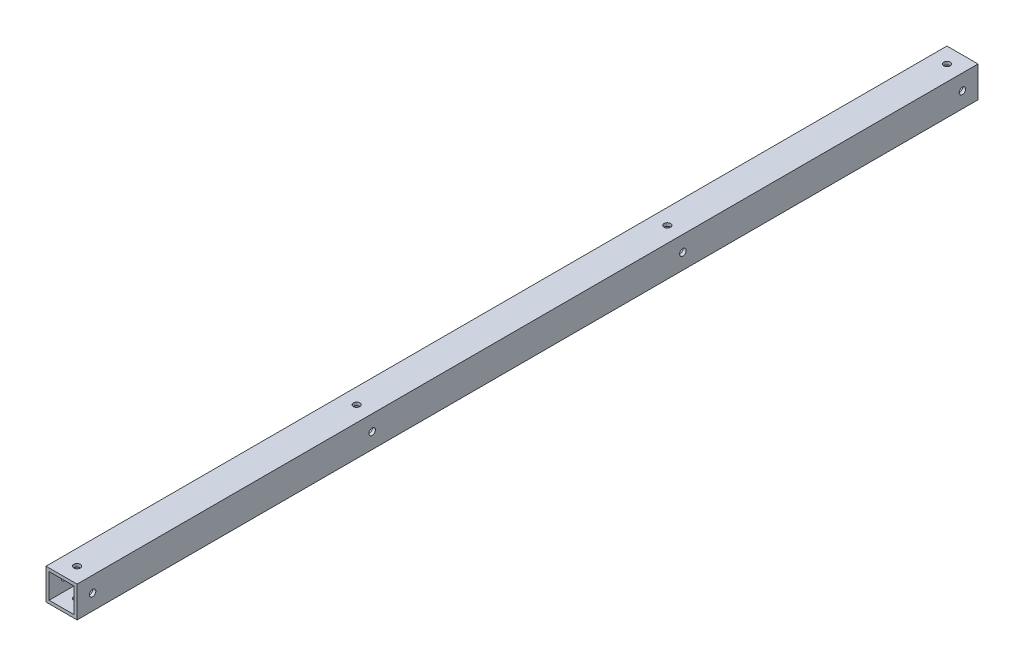
ISO-10303-21;
HEADER;
FILE_DESCRIPTION(('STEP AP214'),'2;1');
FILE_NAME('part.step','',(''),(''),'','','');
FILE_SCHEMA(('AUTOMOTIVE_DESIGN { 1 0 10303 214 1 1 1 1 }'));
ENDSEC;
DATA;
#1=APPLICATION_CONTEXT('core data for automotive mechanical design processes');
#2=APPLICATION_PROTOCOL_DEFINITION('international standard','automotive_design',2000,#1);
#3=PRODUCT_CONTEXT('',#1,'mechanical');
#4=PRODUCT('Part','Part','',(#3));
#5=PRODUCT_RELATED_PRODUCT_CATEGORY('part','',(#4));
#6=PRODUCT_DEFINITION_FORMATION('','',#4);
#7=PRODUCT_DEFINITION_CONTEXT('part definition',#1,'design');
#8=PRODUCT_DEFINITION('design','',#6,#7);
#9=PRODUCT_DEFINITION_SHAPE('','',#8);
#10=(LENGTH_UNIT() NAMED_UNIT(*) SI_UNIT(.MILLI.,.METRE.));
#11=(NAMED_UNIT(*) PLANE_ANGLE_UNIT() SI_UNIT($,.RADIAN.));
#12=(NAMED_UNIT(*) SI_UNIT($,.STERADIAN.) SOLID_ANGLE_UNIT());
#13=UNCERTAINTY_MEASURE_WITH_UNIT(LENGTH_MEASURE(1.E-05),#10,'distance_accuracy_value','');
#14=(GEOMETRIC_REPRESENTATION_CONTEXT(3) GLOBAL_UNCERTAINTY_ASSIGNED_CONTEXT((#13)) GLOBAL_UNIT_ASSIGNED_CONTEXT((#10,
#11,#12)) REPRESENTATION_CONTEXT('',''));
#15=CARTESIAN_POINT('',(0.,0.,0.));
#16=DIRECTION('',(0.,0.,1.));
#17=DIRECTION('',(1.,0.,0.));
#18=AXIS2_PLACEMENT_3D('',#15,#16,#17);
#19=CARTESIAN_POINT('',(0.,-10.,580.));
#20=DIRECTION('',(0.,1.,0.));
#21=DIRECTION('',(0.,0.,1.));
#22=AXIS2_PLACEMENT_3D('',#19,#20,#21);
#23=PLANE('',#22);
#24=CARTESIAN_POINT('',(0.,-10.,570.));
#25=DIRECTION('',(0.,-1.,0.));
#26=DIRECTION('',(0.,0.,-1.));
#27=AXIS2_PLACEMENT_3D('',#24,#25,#26);
#28=CIRCLE('',#27,2.1);
#29=CARTESIAN_POINT('',(0.,-10.,567.9));
#30=VERTEX_POINT('',#29);
#31=EDGE_CURVE('E180',#30,#30,#28,.T.);
#32=ORIENTED_EDGE('',*,*,#31,.F.);
#33=EDGE_LOOP('',(#32));
#34=FACE_BOUND('',#33,.T.);
#35=CARTESIAN_POINT('',(0.,-10.,390.));
#36=DIRECTION('',(0.,-1.,0.));
#37=DIRECTION('',(0.,0.,-1.));
#38=AXIS2_PLACEMENT_3D('',#35,#36,#37);
#39=CIRCLE('',#38,2.09999999999999);
#40=CARTESIAN_POINT('',(0.,-10.,387.9));
#41=VERTEX_POINT('',#40);
#42=EDGE_CURVE('E191',#41,#41,#39,.T.);
#43=ORIENTED_EDGE('',*,*,#42,.F.);
#44=EDGE_LOOP('',(#43));
#45=FACE_BOUND('',#44,.T.);
#46=CARTESIAN_POINT('',(0.,-10.,10.));
#47=DIRECTION('',(0.,1.,0.));
#48=DIRECTION('',(0.,0.,1.));
#49=AXIS2_PLACEMENT_3D('',#46,#47,#48);
#50=CIRCLE('',#49,2.1);
#51=CARTESIAN_POINT('',(0.,-10.,12.1));
#52=VERTEX_POINT('',#51);
#53=EDGE_CURVE('E174',#52,#52,#50,.T.);
#54=ORIENTED_EDGE('',*,*,#53,.T.);
#55=EDGE_LOOP('',(#54));
#56=FACE_BOUND('',#55,.T.);
#57=CARTESIAN_POINT('',(0.,-10.,190.));
#58=DIRECTION('',(0.,1.,0.));
#59=DIRECTION('',(0.,0.,1.));
#60=AXIS2_PLACEMENT_3D('',#57,#58,#59);
#61=CIRCLE('',#60,2.09999999999999);
#62=CARTESIAN_POINT('',(0.,-10.,192.1));
#63=VERTEX_POINT('',#62);
#64=EDGE_CURVE('E205',#63,#63,#61,.T.);
#65=ORIENTED_EDGE('',*,*,#64,.T.);
#66=EDGE_LOOP('',(#65));
#67=FACE_BOUND('',#66,.T.);
#68=DIRECTION('',(1.,0.,0.));
#69=VECTOR('',#68,1.);
#70=CARTESIAN_POINT('',(0.,-10.,0.));
#71=LINE('',#70,#69);
#72=CARTESIAN_POINT('',(-10.,-10.,0.));
#73=VERTEX_POINT('',#72);
#74=CARTESIAN_POINT('',(10.,-10.,0.));
#75=VERTEX_POINT('',#74);
#76=EDGE_CURVE('E152',#73,#75,#71,.T.);
#77=ORIENTED_EDGE('',*,*,#76,.T.);
#78=DIRECTION('',(0.,0.,-1.));
#79=VECTOR('',#78,1.);
#80=CARTESIAN_POINT('',(10.,-10.,580.));
#81=LINE('',#80,#79);
#82=CARTESIAN_POINT('',(10.,-10.,580.));
#83=VERTEX_POINT('',#82);
#84=EDGE_CURVE('E11',#83,#75,#81,.T.);
#85=ORIENTED_EDGE('',*,*,#84,.F.);
#86=DIRECTION('',(1.,0.,0.));
#87=VECTOR('',#86,1.);
#88=CARTESIAN_POINT('',(0.,-10.,580.));
#89=LINE('',#88,#87);
#90=CARTESIAN_POINT('',(-10.,-10.,580.));
#91=VERTEX_POINT('',#90);
#92=EDGE_CURVE('E123',#91,#83,#89,.T.);
#93=ORIENTED_EDGE('',*,*,#92,.F.);
#94=DIRECTION('',(0.,0.,-1.));
#95=VECTOR('',#94,1.);
#96=CARTESIAN_POINT('',(-10.,-10.,580.));
#97=LINE('',#96,#95);
#98=EDGE_CURVE('E62',#91,#73,#97,.T.);
#99=ORIENTED_EDGE('',*,*,#98,.T.);
#100=EDGE_LOOP('',(#77,#85,#93,#99));
#101=FACE_BOUND('',#100,.T.);
#102=ADVANCED_FACE('F43',(#34,#45,#56,#67,#101),#23,.F.);
#103=CARTESIAN_POINT('',(10.,0.,580.));
#104=DIRECTION('',(-1.,0.,0.));
#105=DIRECTION('',(0.,0.,1.));
#106=AXIS2_PLACEMENT_3D('',#103,#104,#105);
#107=PLANE('',#106);
#108=CARTESIAN_POINT('',(10.,0.,570.));
#109=DIRECTION('',(1.,0.,0.));
#110=DIRECTION('',(0.,0.,-1.));
#111=AXIS2_PLACEMENT_3D('',#108,#109,#110);
#112=CIRCLE('',#111,2.10000000000004);
#113=CARTESIAN_POINT('',(10.,0.,567.9));
#114=VERTEX_POINT('',#113);
#115=EDGE_CURVE('E380',#114,#114,#112,.T.);
#116=ORIENTED_EDGE('',*,*,#115,.F.);
#117=EDGE_LOOP('',(#116));
#118=FACE_BOUND('',#117,.T.);
#119=CARTESIAN_POINT('',(10.,0.,190.));
#120=DIRECTION('',(1.,0.,0.));
#121=DIRECTION('',(0.,0.,1.));
#122=AXIS2_PLACEMENT_3D('',#119,#120,#121);
#123=CIRCLE('',#122,2.09999999999999);
#124=CARTESIAN_POINT('',(10.,0.,192.1));
#125=VERTEX_POINT('',#124);
#126=EDGE_CURVE('E371',#125,#125,#123,.T.);
#127=ORIENTED_EDGE('',*,*,#126,.F.);
#128=EDGE_LOOP('',(#127));
#129=FACE_BOUND('',#128,.T.);
#130=CARTESIAN_POINT('',(10.,0.,390.));
#131=DIRECTION('',(1.,0.,0.));
#132=DIRECTION('',(0.,0.,-1.));
#133=AXIS2_PLACEMENT_3D('',#130,#131,#132);
#134=CIRCLE('',#133,2.09999999999999);
#135=CARTESIAN_POINT('',(10.,0.,387.9));
#136=VERTEX_POINT('',#135);
#137=EDGE_CURVE('E370',#136,#136,#134,.T.);
#138=ORIENTED_EDGE('',*,*,#137,.F.);
#139=EDGE_LOOP('',(#138));
#140=FACE_BOUND('',#139,.T.);
#141=CARTESIAN_POINT('',(10.,0.,10.));
#142=DIRECTION('',(1.,0.,0.));
#143=DIRECTION('',(0.,0.,-1.));
#144=AXIS2_PLACEMENT_3D('',#141,#142,#143);
#145=CIRCLE('',#144,2.10000000000004);
#146=CARTESIAN_POINT('',(10.,0.,7.89999999999997));
#147=VERTEX_POINT('',#146);
#148=EDGE_CURVE('E377',#147,#147,#145,.T.);
#149=ORIENTED_EDGE('',*,*,#148,.F.);
#150=EDGE_LOOP('',(#149));
#151=FACE_BOUND('',#150,.T.);
#152=DIRECTION('',(0.,1.,0.));
#153=VECTOR('',#152,1.);
#154=CARTESIAN_POINT('',(10.,0.,0.));
#155=LINE('',#154,#153);
#156=CARTESIAN_POINT('',(10.,10.,0.));
#157=VERTEX_POINT('',#156);
#158=EDGE_CURVE('E129',#75,#157,#155,.T.);
#159=ORIENTED_EDGE('',*,*,#158,.T.);
#160=DIRECTION('',(0.,0.,-1.));
#161=VECTOR('',#160,1.);
#162=CARTESIAN_POINT('',(10.,10.,580.));
#163=LINE('',#162,#161);
#164=CARTESIAN_POINT('',(10.,10.,580.));
#165=VERTEX_POINT('',#164);
#166=EDGE_CURVE('E53',#165,#157,#163,.T.);
#167=ORIENTED_EDGE('',*,*,#166,.F.);
#168=DIRECTION('',(0.,1.,0.));
#169=VECTOR('',#168,1.);
#170=CARTESIAN_POINT('',(10.,0.,580.));
#171=LINE('',#170,#169);
#172=EDGE_CURVE('E117',#83,#165,#171,.T.);
#173=ORIENTED_EDGE('',*,*,#172,.F.);
#174=ORIENTED_EDGE('',*,*,#84,.T.);
#175=EDGE_LOOP('',(#159,#167,#173,#174));
#176=FACE_BOUND('',#175,.T.);
#177=ADVANCED_FACE('F128',(#118,#129,#140,#151,#176),#107,.F.);
#178=CARTESIAN_POINT('',(0.,10.,580.));
#179=DIRECTION('',(0.,1.,0.));
#180=DIRECTION('',(0.,0.,1.));
#181=AXIS2_PLACEMENT_3D('',#178,#179,#180);
#182=PLANE('',#181);
#183=CARTESIAN_POINT('',(0.,10.,570.));
#184=DIRECTION('',(0.,-1.,0.));
#185=DIRECTION('',(0.,0.,-1.));
#186=AXIS2_PLACEMENT_3D('',#183,#184,#185);
#187=CIRCLE('',#186,2.1);
#188=CARTESIAN_POINT('',(0.,10.,567.9));
#189=VERTEX_POINT('',#188);
#190=EDGE_CURVE('E186',#189,#189,#187,.T.);
#191=ORIENTED_EDGE('',*,*,#190,.T.);
#192=EDGE_LOOP('',(#191));
#193=FACE_BOUND('',#192,.T.);
#194=CARTESIAN_POINT('',(0.,10.,390.));
#195=DIRECTION('',(0.,-1.,0.));
#196=DIRECTION('',(0.,0.,-1.));
#197=AXIS2_PLACEMENT_3D('',#194,#195,#196);
#198=CIRCLE('',#197,2.09999999999999);
#199=CARTESIAN_POINT('',(0.,10.,387.9));
#200=VERTEX_POINT('',#199);
#201=EDGE_CURVE('E199',#200,#200,#198,.T.);
#202=ORIENTED_EDGE('',*,*,#201,.T.);
#203=EDGE_LOOP('',(#202));
#204=FACE_BOUND('',#203,.T.);
#205=CARTESIAN_POINT('',(0.,10.,10.));
#206=DIRECTION('',(0.,1.,0.));
#207=DIRECTION('',(0.,0.,1.));
#208=AXIS2_PLACEMENT_3D('',#205,#206,#207);
#209=CIRCLE('',#208,2.1);
#210=CARTESIAN_POINT('',(0.,10.,12.1));
#211=VERTEX_POINT('',#210);
#212=EDGE_CURVE('E208',#211,#211,#209,.T.);
#213=ORIENTED_EDGE('',*,*,#212,.F.);
#214=EDGE_LOOP('',(#213));
#215=FACE_BOUND('',#214,.T.);
#216=CARTESIAN_POINT('',(0.,10.,190.));
#217=DIRECTION('',(0.,1.,0.));
#218=DIRECTION('',(0.,0.,1.));
#219=AXIS2_PLACEMENT_3D('',#216,#217,#218);
#220=CIRCLE('',#219,2.09999999999999);
#221=CARTESIAN_POINT('',(0.,10.,192.1));
#222=VERTEX_POINT('',#221);
#223=EDGE_CURVE('E211',#222,#222,#220,.T.);
#224=ORIENTED_EDGE('',*,*,#223,.F.);
#225=EDGE_LOOP('',(#224));
#226=FACE_BOUND('',#225,.T.);
#227=DIRECTION('',(1.,0.,0.));
#228=VECTOR('',#227,1.);
#229=CARTESIAN_POINT('',(0.,10.,0.));
#230=LINE('',#229,#228);
#231=CARTESIAN_POINT('',(-10.,10.,0.));
#232=VERTEX_POINT('',#231);
#233=EDGE_CURVE('E155',#232,#157,#230,.T.);
#234=ORIENTED_EDGE('',*,*,#233,.F.);
#235=DIRECTION('',(0.,0.,-1.));
#236=VECTOR('',#235,1.);
#237=CARTESIAN_POINT('',(-10.,10.,580.));
#238=LINE('',#237,#236);
#239=CARTESIAN_POINT('',(-10.,10.,580.));
#240=VERTEX_POINT('',#239);
#241=EDGE_CURVE('E88',#240,#232,#238,.T.);
#242=ORIENTED_EDGE('',*,*,#241,.F.);
#243=DIRECTION('',(1.,0.,0.));
#244=VECTOR('',#243,1.);
#245=CARTESIAN_POINT('',(0.,10.,580.));
#246=LINE('',#245,#244);
#247=EDGE_CURVE('E122',#240,#165,#246,.T.);
#248=ORIENTED_EDGE('',*,*,#247,.T.);
#249=ORIENTED_EDGE('',*,*,#166,.T.);
#250=EDGE_LOOP('',(#234,#242,#248,#249));
#251=FACE_BOUND('',#250,.T.);
#252=ADVANCED_FACE('F133',(#193,#204,#215,#226,#251),#182,.T.);
#253=CARTESIAN_POINT('',(8.,0.,580.));
#254=DIRECTION('',(-1.,0.,0.));
#255=DIRECTION('',(0.,0.,1.));
#256=AXIS2_PLACEMENT_3D('',#253,#254,#255);
#257=PLANE('',#256);
#258=CARTESIAN_POINT('',(8.,0.,570.));
#259=DIRECTION('',(-1.,0.,0.));
#260=DIRECTION('',(0.,0.,1.));
#261=AXIS2_PLACEMENT_3D('',#258,#259,#260);
#262=CIRCLE('',#261,2.10000000000004);
#263=CARTESIAN_POINT('',(8.,0.,572.1));
#264=VERTEX_POINT('',#263);
#265=EDGE_CURVE('E194',#264,#264,#262,.T.);
#266=ORIENTED_EDGE('',*,*,#265,.F.);
#267=EDGE_LOOP('',(#266));
#268=FACE_BOUND('',#267,.T.);
#269=CARTESIAN_POINT('',(8.,0.,190.));
#270=DIRECTION('',(-1.,0.,0.));
#271=DIRECTION('',(0.,0.,1.));
#272=AXIS2_PLACEMENT_3D('',#269,#270,#271);
#273=CIRCLE('',#272,2.09999999999999);
#274=CARTESIAN_POINT('',(8.,0.,192.1));
#275=VERTEX_POINT('',#274);
#276=EDGE_CURVE('E354',#275,#275,#273,.T.);
#277=ORIENTED_EDGE('',*,*,#276,.F.);
#278=EDGE_LOOP('',(#277));
#279=FACE_BOUND('',#278,.T.);
#280=CARTESIAN_POINT('',(8.,0.,390.));
#281=DIRECTION('',(-1.,0.,0.));
#282=DIRECTION('',(0.,0.,1.));
#283=AXIS2_PLACEMENT_3D('',#280,#281,#282);
#284=CIRCLE('',#283,2.09999999999999);
#285=CARTESIAN_POINT('',(8.,0.,392.1));
#286=VERTEX_POINT('',#285);
#287=EDGE_CURVE('E359',#286,#286,#284,.T.);
#288=ORIENTED_EDGE('',*,*,#287,.F.);
#289=EDGE_LOOP('',(#288));
#290=FACE_BOUND('',#289,.T.);
#291=CARTESIAN_POINT('',(8.,0.,10.));
#292=DIRECTION('',(-1.,0.,0.));
#293=DIRECTION('',(0.,0.,1.));
#294=AXIS2_PLACEMENT_3D('',#291,#292,#293);
#295=CIRCLE('',#294,2.10000000000004);
#296=CARTESIAN_POINT('',(8.,0.,12.1000000000001));
#297=VERTEX_POINT('',#296);
#298=EDGE_CURVE('E363',#297,#297,#295,.T.);
#299=ORIENTED_EDGE('',*,*,#298,.F.);
#300=EDGE_LOOP('',(#299));
#301=FACE_BOUND('',#300,.T.);
#302=DIRECTION('',(0.,1.,0.));
#303=VECTOR('',#302,1.);
#304=CARTESIAN_POINT('',(8.,0.,0.));
#305=LINE('',#304,#303);
#306=CARTESIAN_POINT('',(8.,-8.,0.));
#307=VERTEX_POINT('',#306);
#308=CARTESIAN_POINT('',(8.,8.,0.));
#309=VERTEX_POINT('',#308);
#310=EDGE_CURVE('E140',#307,#309,#305,.T.);
#311=ORIENTED_EDGE('',*,*,#310,.F.);
#312=DIRECTION('',(0.,0.,-1.));
#313=VECTOR('',#312,1.);
#314=CARTESIAN_POINT('',(8.,-8.,580.));
#315=LINE('',#314,#313);
#316=CARTESIAN_POINT('',(8.,-8.,580.));
#317=VERTEX_POINT('',#316);
#318=EDGE_CURVE('E100',#317,#307,#315,.T.);
#319=ORIENTED_EDGE('',*,*,#318,.F.);
#320=DIRECTION('',(0.,1.,0.));
#321=VECTOR('',#320,1.);
#322=CARTESIAN_POINT('',(8.,0.,580.));
#323=LINE('',#322,#321);
#324=CARTESIAN_POINT('',(8.,8.,580.));
#325=VERTEX_POINT('',#324);
#326=EDGE_CURVE('E160',#317,#325,#323,.T.);
#327=ORIENTED_EDGE('',*,*,#326,.T.);
#328=DIRECTION('',(0.,0.,-1.));
#329=VECTOR('',#328,1.);
#330=CARTESIAN_POINT('',(8.,8.,580.));
#331=LINE('',#330,#329);
#332=EDGE_CURVE('E136',#325,#309,#331,.T.);
#333=ORIENTED_EDGE('',*,*,#332,.T.);
#334=EDGE_LOOP('',(#311,#319,#327,#333));
#335=FACE_BOUND('',#334,.T.);
#336=ADVANCED_FACE('F45',(#268,#279,#290,#301,#335),#257,.T.);
#337=CARTESIAN_POINT('',(0.,-8.,580.));
#338=DIRECTION('',(0.,1.,0.));
#339=DIRECTION('',(0.,0.,1.));
#340=AXIS2_PLACEMENT_3D('',#337,#338,#339);
#341=PLANE('',#340);
#342=CARTESIAN_POINT('',(0.,-8.,570.));
#343=DIRECTION('',(0.,1.,0.));
#344=DIRECTION('',(0.,0.,1.));
#345=AXIS2_PLACEMENT_3D('',#342,#343,#344);
#346=CIRCLE('',#345,2.1);
#347=CARTESIAN_POINT('',(0.,-8.,572.1));
#348=VERTEX_POINT('',#347);
#349=EDGE_CURVE('E202',#348,#348,#346,.F.);
#350=ORIENTED_EDGE('',*,*,#349,.T.);
#351=EDGE_LOOP('',(#350));
#352=FACE_BOUND('',#351,.T.);
#353=CARTESIAN_POINT('',(0.,-8.,390.));
#354=DIRECTION('',(0.,1.,0.));
#355=DIRECTION('',(0.,0.,1.));
#356=AXIS2_PLACEMENT_3D('',#353,#354,#355);
#357=CIRCLE('',#356,2.09999999999999);
#358=CARTESIAN_POINT('',(0.,-8.,392.1));
#359=VERTEX_POINT('',#358);
#360=EDGE_CURVE('E179',#359,#359,#357,.F.);
#361=ORIENTED_EDGE('',*,*,#360,.T.);
#362=EDGE_LOOP('',(#361));
#363=FACE_BOUND('',#362,.T.);
#364=CARTESIAN_POINT('',(0.,-8.,10.));
#365=DIRECTION('',(0.,1.,0.));
#366=DIRECTION('',(0.,0.,1.));
#367=AXIS2_PLACEMENT_3D('',#364,#365,#366);
#368=CIRCLE('',#367,2.1);
#369=CARTESIAN_POINT('',(0.,-8.,12.1));
#370=VERTEX_POINT('',#369);
#371=EDGE_CURVE('E144',#370,#370,#368,.T.);
#372=ORIENTED_EDGE('',*,*,#371,.F.);
#373=EDGE_LOOP('',(#372));
#374=FACE_BOUND('',#373,.T.);
#375=CARTESIAN_POINT('',(0.,-8.,190.));
#376=DIRECTION('',(0.,1.,0.));
#377=DIRECTION('',(0.,0.,1.));
#378=AXIS2_PLACEMENT_3D('',#375,#376,#377);
#379=CIRCLE('',#378,2.09999999999999);
#380=CARTESIAN_POINT('',(0.,-8.,192.1));
#381=VERTEX_POINT('',#380);
#382=EDGE_CURVE('E173',#381,#381,#379,.T.);
#383=ORIENTED_EDGE('',*,*,#382,.F.);
#384=EDGE_LOOP('',(#383));
#385=FACE_BOUND('',#384,.T.);
#386=DIRECTION('',(1.,0.,0.));
#387=VECTOR('',#386,1.);
#388=CARTESIAN_POINT('',(0.,-8.,0.));
#389=LINE('',#388,#387);
#390=CARTESIAN_POINT('',(-8.,-8.,0.));
#391=VERTEX_POINT('',#390);
#392=EDGE_CURVE('E143',#391,#307,#389,.T.);
#393=ORIENTED_EDGE('',*,*,#392,.F.);
#394=DIRECTION('',(0.,0.,-1.));
#395=VECTOR('',#394,1.);
#396=CARTESIAN_POINT('',(-8.,-8.,580.));
#397=LINE('',#396,#395);
#398=CARTESIAN_POINT('',(-8.,-8.,580.));
#399=VERTEX_POINT('',#398);
#400=EDGE_CURVE('E167',#399,#391,#397,.T.);
#401=ORIENTED_EDGE('',*,*,#400,.F.);
#402=DIRECTION('',(1.,0.,0.));
#403=VECTOR('',#402,1.);
#404=CARTESIAN_POINT('',(0.,-8.,580.));
#405=LINE('',#404,#403);
#406=EDGE_CURVE('E221',#399,#317,#405,.T.);
#407=ORIENTED_EDGE('',*,*,#406,.T.);
#408=ORIENTED_EDGE('',*,*,#318,.T.);
#409=EDGE_LOOP('',(#393,#401,#407,#408));
#410=FACE_BOUND('',#409,.T.);
#411=ADVANCED_FACE('F237',(#352,#363,#374,#385,#410),#341,.T.);
#412=CARTESIAN_POINT('',(-8.,0.,580.));
#413=DIRECTION('',(-1.,0.,0.));
#414=DIRECTION('',(0.,0.,1.));
#415=AXIS2_PLACEMENT_3D('',#412,#413,#414);
#416=PLANE('',#415);
#417=CARTESIAN_POINT('',(-8.,0.,570.));
#418=DIRECTION('',(-1.,0.,0.));
#419=DIRECTION('',(0.,0.,1.));
#420=AXIS2_PLACEMENT_3D('',#417,#418,#419);
#421=CIRCLE('',#420,2.10000000000004);
#422=CARTESIAN_POINT('',(-8.,0.,572.1));
#423=VERTEX_POINT('',#422);
#424=EDGE_CURVE('E272',#423,#423,#421,.T.);
#425=ORIENTED_EDGE('',*,*,#424,.T.);
#426=EDGE_LOOP('',(#425));
#427=FACE_BOUND('',#426,.T.);
#428=CARTESIAN_POINT('',(-8.,0.,190.));
#429=DIRECTION('',(-1.,0.,0.));
#430=DIRECTION('',(0.,0.,1.));
#431=AXIS2_PLACEMENT_3D('',#428,#429,#430);
#432=CIRCLE('',#431,2.09999999999999);
#433=CARTESIAN_POINT('',(-8.,0.,192.1));
#434=VERTEX_POINT('',#433);
#435=EDGE_CURVE('E276',#434,#434,#432,.T.);
#436=ORIENTED_EDGE('',*,*,#435,.T.);
#437=EDGE_LOOP('',(#436));
#438=FACE_BOUND('',#437,.T.);
#439=CARTESIAN_POINT('',(-8.,0.,390.));
#440=DIRECTION('',(-1.,0.,0.));
#441=DIRECTION('',(0.,0.,1.));
#442=AXIS2_PLACEMENT_3D('',#439,#440,#441);
#443=CIRCLE('',#442,2.09999999999999);
#444=CARTESIAN_POINT('',(-8.,0.,392.1));
#445=VERTEX_POINT('',#444);
#446=EDGE_CURVE('E280',#445,#445,#443,.T.);
#447=ORIENTED_EDGE('',*,*,#446,.T.);
#448=EDGE_LOOP('',(#447));
#449=FACE_BOUND('',#448,.T.);
#450=CARTESIAN_POINT('',(-8.,0.,10.));
#451=DIRECTION('',(-1.,0.,0.));
#452=DIRECTION('',(0.,0.,1.));
#453=AXIS2_PLACEMENT_3D('',#450,#451,#452);
#454=CIRCLE('',#453,2.10000000000004);
#455=CARTESIAN_POINT('',(-8.,0.,12.1000000000001));
#456=VERTEX_POINT('',#455);
#457=EDGE_CURVE('E284',#456,#456,#454,.T.);
#458=ORIENTED_EDGE('',*,*,#457,.T.);
#459=EDGE_LOOP('',(#458));
#460=FACE_BOUND('',#459,.T.);
#461=DIRECTION('',(0.,1.,0.));
#462=VECTOR('',#461,1.);
#463=CARTESIAN_POINT('',(-8.,0.,0.));
#464=LINE('',#463,#462);
#465=CARTESIAN_POINT('',(-8.,8.,0.));
#466=VERTEX_POINT('',#465);
#467=EDGE_CURVE('E147',#391,#466,#464,.T.);
#468=ORIENTED_EDGE('',*,*,#467,.T.);
#469=DIRECTION('',(0.,0.,-1.));
#470=VECTOR('',#469,1.);
#471=CARTESIAN_POINT('',(-8.,8.,580.));
#472=LINE('',#471,#470);
#473=CARTESIAN_POINT('',(-8.,8.,580.));
#474=VERTEX_POINT('',#473);
#475=EDGE_CURVE('E164',#474,#466,#472,.T.);
#476=ORIENTED_EDGE('',*,*,#475,.F.);
#477=DIRECTION('',(0.,1.,0.));
#478=VECTOR('',#477,1.);
#479=CARTESIAN_POINT('',(-8.,0.,580.));
#480=LINE('',#479,#478);
#481=EDGE_CURVE('E224',#399,#474,#480,.T.);
#482=ORIENTED_EDGE('',*,*,#481,.F.);
#483=ORIENTED_EDGE('',*,*,#400,.T.);
#484=EDGE_LOOP('',(#468,#476,#482,#483));
#485=FACE_BOUND('',#484,.T.);
#486=ADVANCED_FACE('F244',(#427,#438,#449,#460,#485),#416,.F.);
#487=CARTESIAN_POINT('',(0.,8.,580.));
#488=DIRECTION('',(0.,1.,0.));
#489=DIRECTION('',(0.,0.,1.));
#490=AXIS2_PLACEMENT_3D('',#487,#488,#489);
#491=PLANE('',#490);
#492=CARTESIAN_POINT('',(0.,7.99999999999999,570.));
#493=DIRECTION('',(0.,1.,0.));
#494=DIRECTION('',(0.,0.,1.));
#495=AXIS2_PLACEMENT_3D('',#492,#493,#494);
#496=CIRCLE('',#495,2.1);
#497=CARTESIAN_POINT('',(0.,7.99999999999999,572.1));
#498=VERTEX_POINT('',#497);
#499=EDGE_CURVE('E47',#498,#498,#496,.F.);
#500=ORIENTED_EDGE('',*,*,#499,.F.);
#501=EDGE_LOOP('',(#500));
#502=FACE_BOUND('',#501,.T.);
#503=CARTESIAN_POINT('',(0.,7.99999999999999,390.));
#504=DIRECTION('',(0.,1.,0.));
#505=DIRECTION('',(0.,0.,1.));
#506=AXIS2_PLACEMENT_3D('',#503,#504,#505);
#507=CIRCLE('',#506,2.09999999999999);
#508=CARTESIAN_POINT('',(0.,7.99999999999999,392.1));
#509=VERTEX_POINT('',#508);
#510=EDGE_CURVE('E177',#509,#509,#507,.F.);
#511=ORIENTED_EDGE('',*,*,#510,.F.);
#512=EDGE_LOOP('',(#511));
#513=FACE_BOUND('',#512,.T.);
#514=CARTESIAN_POINT('',(0.,7.99999999999999,10.));
#515=DIRECTION('',(0.,1.,0.));
#516=DIRECTION('',(0.,0.,1.));
#517=AXIS2_PLACEMENT_3D('',#514,#515,#516);
#518=CIRCLE('',#517,2.1);
#519=CARTESIAN_POINT('',(0.,7.99999999999999,12.1));
#520=VERTEX_POINT('',#519);
#521=EDGE_CURVE('E175',#520,#520,#518,.T.);
#522=ORIENTED_EDGE('',*,*,#521,.T.);
#523=EDGE_LOOP('',(#522));
#524=FACE_BOUND('',#523,.T.);
#525=CARTESIAN_POINT('',(0.,7.99999999999999,190.));
#526=DIRECTION('',(0.,1.,0.));
#527=DIRECTION('',(0.,0.,1.));
#528=AXIS2_PLACEMENT_3D('',#525,#526,#527);
#529=CIRCLE('',#528,2.09999999999999);
#530=CARTESIAN_POINT('',(0.,7.99999999999999,192.1));
#531=VERTEX_POINT('',#530);
#532=EDGE_CURVE('E170',#531,#531,#529,.T.);
#533=ORIENTED_EDGE('',*,*,#532,.T.);
#534=EDGE_LOOP('',(#533));
#535=FACE_BOUND('',#534,.T.);
#536=DIRECTION('',(1.,0.,0.));
#537=VECTOR('',#536,1.);
#538=CARTESIAN_POINT('',(0.,8.,0.));
#539=LINE('',#538,#537);
#540=EDGE_CURVE('E149',#466,#309,#539,.T.);
#541=ORIENTED_EDGE('',*,*,#540,.T.);
#542=ORIENTED_EDGE('',*,*,#332,.F.);
#543=DIRECTION('',(1.,0.,0.));
#544=VECTOR('',#543,1.);
#545=CARTESIAN_POINT('',(0.,8.,580.));
#546=LINE('',#545,#544);
#547=EDGE_CURVE('E226',#474,#325,#546,.T.);
#548=ORIENTED_EDGE('',*,*,#547,.F.);
#549=ORIENTED_EDGE('',*,*,#475,.T.);
#550=EDGE_LOOP('',(#541,#542,#548,#549));
#551=FACE_BOUND('',#550,.T.);
#552=ADVANCED_FACE('F234',(#502,#513,#524,#535,#551),#491,.F.);
#553=CARTESIAN_POINT('',(-10.,0.,580.));
#554=DIRECTION('',(-1.,0.,0.));
#555=DIRECTION('',(0.,0.,1.));
#556=AXIS2_PLACEMENT_3D('',#553,#554,#555);
#557=PLANE('',#556);
#558=CARTESIAN_POINT('',(-10.,0.,570.));
#559=DIRECTION('',(1.,0.,0.));
#560=DIRECTION('',(0.,0.,-1.));
#561=AXIS2_PLACEMENT_3D('',#558,#559,#560);
#562=CIRCLE('',#561,2.10000000000004);
#563=CARTESIAN_POINT('',(-10.,0.,567.9));
#564=VERTEX_POINT('',#563);
#565=EDGE_CURVE('E353',#564,#564,#562,.T.);
#566=ORIENTED_EDGE('',*,*,#565,.T.);
#567=EDGE_LOOP('',(#566));
#568=FACE_BOUND('',#567,.T.);
#569=CARTESIAN_POINT('',(-10.,0.,190.));
#570=DIRECTION('',(1.,0.,0.));
#571=DIRECTION('',(0.,0.,1.));
#572=AXIS2_PLACEMENT_3D('',#569,#570,#571);
#573=CIRCLE('',#572,2.09999999999999);
#574=CARTESIAN_POINT('',(-10.,0.,192.1));
#575=VERTEX_POINT('',#574);
#576=EDGE_CURVE('E381',#575,#575,#573,.T.);
#577=ORIENTED_EDGE('',*,*,#576,.T.);
#578=EDGE_LOOP('',(#577));
#579=FACE_BOUND('',#578,.T.);
#580=CARTESIAN_POINT('',(-10.,0.,390.));
#581=DIRECTION('',(1.,0.,0.));
#582=DIRECTION('',(0.,0.,-1.));
#583=AXIS2_PLACEMENT_3D('',#580,#581,#582);
#584=CIRCLE('',#583,2.09999999999999);
#585=CARTESIAN_POINT('',(-10.,0.,387.9));
#586=VERTEX_POINT('',#585);
#587=EDGE_CURVE('E367',#586,#586,#584,.T.);
#588=ORIENTED_EDGE('',*,*,#587,.T.);
#589=EDGE_LOOP('',(#588));
#590=FACE_BOUND('',#589,.T.);
#591=CARTESIAN_POINT('',(-10.,0.,10.));
#592=DIRECTION('',(1.,0.,0.));
#593=DIRECTION('',(0.,0.,-1.));
#594=AXIS2_PLACEMENT_3D('',#591,#592,#593);
#595=CIRCLE('',#594,2.10000000000004);
#596=CARTESIAN_POINT('',(-10.,0.,7.89999999999997));
#597=VERTEX_POINT('',#596);
#598=EDGE_CURVE('E374',#597,#597,#595,.T.);
#599=ORIENTED_EDGE('',*,*,#598,.T.);
#600=EDGE_LOOP('',(#599));
#601=FACE_BOUND('',#600,.T.);
#602=DIRECTION('',(0.,1.,0.));
#603=VECTOR('',#602,1.);
#604=CARTESIAN_POINT('',(-10.,0.,0.));
#605=LINE('',#604,#603);
#606=EDGE_CURVE('E157',#73,#232,#605,.T.);
#607=ORIENTED_EDGE('',*,*,#606,.F.);
#608=ORIENTED_EDGE('',*,*,#98,.F.);
#609=DIRECTION('',(0.,1.,0.));
#610=VECTOR('',#609,1.);
#611=CARTESIAN_POINT('',(-10.,0.,580.));
#612=LINE('',#611,#610);
#613=EDGE_CURVE('E134',#91,#240,#612,.T.);
#614=ORIENTED_EDGE('',*,*,#613,.T.);
#615=ORIENTED_EDGE('',*,*,#241,.T.);
#616=EDGE_LOOP('',(#607,#608,#614,#615));
#617=FACE_BOUND('',#616,.T.);
#618=ADVANCED_FACE('F263',(#568,#579,#590,#601,#617),#557,.T.);
#619=CARTESIAN_POINT('',(0.,0.,580.));
#620=DIRECTION('',(0.,0.,1.));
#621=DIRECTION('',(1.,0.,0.));
#622=AXIS2_PLACEMENT_3D('',#619,#620,#621);
#623=PLANE('',#622);
#624=ORIENTED_EDGE('',*,*,#326,.F.);
#625=ORIENTED_EDGE('',*,*,#406,.F.);
#626=ORIENTED_EDGE('',*,*,#481,.T.);
#627=ORIENTED_EDGE('',*,*,#547,.T.);
#628=EDGE_LOOP('',(#624,#625,#626,#627));
#629=FACE_BOUND('',#628,.T.);
#630=ORIENTED_EDGE('',*,*,#92,.T.);
#631=ORIENTED_EDGE('',*,*,#172,.T.);
#632=ORIENTED_EDGE('',*,*,#247,.F.);
#633=ORIENTED_EDGE('',*,*,#613,.F.);
#634=EDGE_LOOP('',(#630,#631,#632,#633));
#635=FACE_BOUND('',#634,.T.);
#636=ADVANCED_FACE('F119',(#629,#635),#623,.T.);
#637=CARTESIAN_POINT('',(0.,0.,0.));
#638=DIRECTION('',(0.,0.,1.));
#639=DIRECTION('',(1.,0.,0.));
#640=AXIS2_PLACEMENT_3D('',#637,#638,#639);
#641=PLANE('',#640);
#642=ORIENTED_EDGE('',*,*,#310,.T.);
#643=ORIENTED_EDGE('',*,*,#540,.F.);
#644=ORIENTED_EDGE('',*,*,#467,.F.);
#645=ORIENTED_EDGE('',*,*,#392,.T.);
#646=EDGE_LOOP('',(#642,#643,#644,#645));
#647=FACE_BOUND('',#646,.T.);
#648=ORIENTED_EDGE('',*,*,#76,.F.);
#649=ORIENTED_EDGE('',*,*,#606,.T.);
#650=ORIENTED_EDGE('',*,*,#233,.T.);
#651=ORIENTED_EDGE('',*,*,#158,.F.);
#652=EDGE_LOOP('',(#648,#649,#650,#651));
#653=FACE_BOUND('',#652,.T.);
#654=ADVANCED_FACE('F288',(#647,#653),#641,.F.);
#655=CARTESIAN_POINT('',(0.,-10.,190.));
#656=DIRECTION('',(0.,1.,0.));
#657=DIRECTION('',(0.,0.,1.));
#658=AXIS2_PLACEMENT_3D('',#655,#656,#657);
#659=CYLINDRICAL_SURFACE('',#658,2.09999999999999);
#660=ORIENTED_EDGE('',*,*,#223,.T.);
#661=EDGE_LOOP('',(#660));
#662=FACE_BOUND('',#661,.T.);
#663=ORIENTED_EDGE('',*,*,#532,.F.);
#664=EDGE_LOOP('',(#663));
#665=FACE_BOUND('',#664,.T.);
#666=ADVANCED_FACE('F292',(#662,#665),#659,.F.);
#667=CARTESIAN_POINT('',(0.,-10.,10.));
#668=DIRECTION('',(0.,1.,0.));
#669=DIRECTION('',(0.,0.,1.));
#670=AXIS2_PLACEMENT_3D('',#667,#668,#669);
#671=CYLINDRICAL_SURFACE('',#670,2.1);
#672=ORIENTED_EDGE('',*,*,#212,.T.);
#673=EDGE_LOOP('',(#672));
#674=FACE_BOUND('',#673,.T.);
#675=ORIENTED_EDGE('',*,*,#521,.F.);
#676=EDGE_LOOP('',(#675));
#677=FACE_BOUND('',#676,.T.);
#678=ADVANCED_FACE('F308',(#674,#677),#671,.F.);
#679=ORIENTED_EDGE('',*,*,#382,.T.);
#680=EDGE_LOOP('',(#679));
#681=FACE_BOUND('',#680,.T.);
#682=ORIENTED_EDGE('',*,*,#64,.F.);
#683=EDGE_LOOP('',(#682));
#684=FACE_BOUND('',#683,.T.);
#685=ADVANCED_FACE('F304',(#681,#684),#659,.F.);
#686=ORIENTED_EDGE('',*,*,#371,.T.);
#687=EDGE_LOOP('',(#686));
#688=FACE_BOUND('',#687,.T.);
#689=ORIENTED_EDGE('',*,*,#53,.F.);
#690=EDGE_LOOP('',(#689));
#691=FACE_BOUND('',#690,.T.);
#692=ADVANCED_FACE('F307',(#688,#691),#671,.F.);
#693=CARTESIAN_POINT('',(0.,-10.,390.));
#694=DIRECTION('',(0.,1.,0.));
#695=DIRECTION('',(0.,0.,1.));
#696=AXIS2_PLACEMENT_3D('',#693,#694,#695);
#697=CYLINDRICAL_SURFACE('',#696,2.09999999999999);
#698=ORIENTED_EDGE('',*,*,#201,.F.);
#699=EDGE_LOOP('',(#698));
#700=FACE_BOUND('',#699,.T.);
#701=ORIENTED_EDGE('',*,*,#510,.T.);
#702=EDGE_LOOP('',(#701));
#703=FACE_BOUND('',#702,.T.);
#704=ADVANCED_FACE('F311',(#700,#703),#697,.F.);
#705=CARTESIAN_POINT('',(0.,-10.,570.));
#706=DIRECTION('',(0.,1.,0.));
#707=DIRECTION('',(0.,0.,1.));
#708=AXIS2_PLACEMENT_3D('',#705,#706,#707);
#709=CYLINDRICAL_SURFACE('',#708,2.1);
#710=ORIENTED_EDGE('',*,*,#190,.F.);
#711=EDGE_LOOP('',(#710));
#712=FACE_BOUND('',#711,.T.);
#713=ORIENTED_EDGE('',*,*,#499,.T.);
#714=EDGE_LOOP('',(#713));
#715=FACE_BOUND('',#714,.T.);
#716=ADVANCED_FACE('F317',(#712,#715),#709,.F.);
#717=ORIENTED_EDGE('',*,*,#360,.F.);
#718=EDGE_LOOP('',(#717));
#719=FACE_BOUND('',#718,.T.);
#720=ORIENTED_EDGE('',*,*,#42,.T.);
#721=EDGE_LOOP('',(#720));
#722=FACE_BOUND('',#721,.T.);
#723=ADVANCED_FACE('F313',(#719,#722),#697,.F.);
#724=ORIENTED_EDGE('',*,*,#349,.F.);
#725=EDGE_LOOP('',(#724));
#726=FACE_BOUND('',#725,.T.);
#727=ORIENTED_EDGE('',*,*,#31,.T.);
#728=EDGE_LOOP('',(#727));
#729=FACE_BOUND('',#728,.T.);
#730=ADVANCED_FACE('F316',(#726,#729),#709,.F.);
#731=CARTESIAN_POINT('',(-10.,0.,10.));
#732=DIRECTION('',(1.,0.,0.));
#733=DIRECTION('',(0.,0.,-1.));
#734=AXIS2_PLACEMENT_3D('',#731,#732,#733);
#735=CYLINDRICAL_SURFACE('',#734,2.10000000000004);
#736=ORIENTED_EDGE('',*,*,#598,.F.);
#737=EDGE_LOOP('',(#736));
#738=FACE_BOUND('',#737,.T.);
#739=ORIENTED_EDGE('',*,*,#457,.F.);
#740=EDGE_LOOP('',(#739));
#741=FACE_BOUND('',#740,.T.);
#742=ADVANCED_FACE('F321',(#738,#741),#735,.F.);
#743=CARTESIAN_POINT('',(-10.,0.,390.));
#744=DIRECTION('',(1.,0.,0.));
#745=DIRECTION('',(0.,0.,-1.));
#746=AXIS2_PLACEMENT_3D('',#743,#744,#745);
#747=CYLINDRICAL_SURFACE('',#746,2.09999999999999);
#748=ORIENTED_EDGE('',*,*,#587,.F.);
#749=EDGE_LOOP('',(#748));
#750=FACE_BOUND('',#749,.T.);
#751=ORIENTED_EDGE('',*,*,#446,.F.);
#752=EDGE_LOOP('',(#751));
#753=FACE_BOUND('',#752,.T.);
#754=ADVANCED_FACE('F329',(#750,#753),#747,.F.);
#755=CARTESIAN_POINT('',(-10.,0.,190.));
#756=DIRECTION('',(1.,0.,0.));
#757=DIRECTION('',(0.,0.,-1.));
#758=AXIS2_PLACEMENT_3D('',#755,#756,#757);
#759=CYLINDRICAL_SURFACE('',#758,2.09999999999999);
#760=ORIENTED_EDGE('',*,*,#576,.F.);
#761=EDGE_LOOP('',(#760));
#762=FACE_BOUND('',#761,.T.);
#763=ORIENTED_EDGE('',*,*,#435,.F.);
#764=EDGE_LOOP('',(#763));
#765=FACE_BOUND('',#764,.T.);
#766=ADVANCED_FACE('F338',(#762,#765),#759,.F.);
#767=CARTESIAN_POINT('',(-10.,0.,570.));
#768=DIRECTION('',(1.,0.,0.));
#769=DIRECTION('',(0.,0.,-1.));
#770=AXIS2_PLACEMENT_3D('',#767,#768,#769);
#771=CYLINDRICAL_SURFACE('',#770,2.10000000000004);
#772=ORIENTED_EDGE('',*,*,#565,.F.);
#773=EDGE_LOOP('',(#772));
#774=FACE_BOUND('',#773,.T.);
#775=ORIENTED_EDGE('',*,*,#424,.F.);
#776=EDGE_LOOP('',(#775));
#777=FACE_BOUND('',#776,.T.);
#778=ADVANCED_FACE('F332',(#774,#777),#771,.F.);
#779=ORIENTED_EDGE('',*,*,#298,.T.);
#780=EDGE_LOOP('',(#779));
#781=FACE_BOUND('',#780,.T.);
#782=ORIENTED_EDGE('',*,*,#148,.T.);
#783=EDGE_LOOP('',(#782));
#784=FACE_BOUND('',#783,.T.);
#785=ADVANCED_FACE('F327',(#781,#784),#735,.F.);
#786=ORIENTED_EDGE('',*,*,#287,.T.);
#787=EDGE_LOOP('',(#786));
#788=FACE_BOUND('',#787,.T.);
#789=ORIENTED_EDGE('',*,*,#137,.T.);
#790=EDGE_LOOP('',(#789));
#791=FACE_BOUND('',#790,.T.);
#792=ADVANCED_FACE('F323',(#788,#791),#747,.F.);
#793=ORIENTED_EDGE('',*,*,#276,.T.);
#794=EDGE_LOOP('',(#793));
#795=FACE_BOUND('',#794,.T.);
#796=ORIENTED_EDGE('',*,*,#126,.T.);
#797=EDGE_LOOP('',(#796));
#798=FACE_BOUND('',#797,.T.);
#799=ADVANCED_FACE('F326',(#795,#798),#759,.F.);
#800=ORIENTED_EDGE('',*,*,#265,.T.);
#801=EDGE_LOOP('',(#800));
#802=FACE_BOUND('',#801,.T.);
#803=ORIENTED_EDGE('',*,*,#115,.T.);
#804=EDGE_LOOP('',(#803));
#805=FACE_BOUND('',#804,.T.);
#806=ADVANCED_FACE('F336',(#802,#805),#771,.F.);
#807=CLOSED_SHELL('',(#102,#177,#252,#336,#411,#486,#552,#618,#636,#654,#666,#678,#685,#692,
#704,#716,#723,#730,#742,#754,#766,#778,#785,#792,#799,#806));
#808=MANIFOLD_SOLID_BREP('B2',#807);
#809=ADVANCED_BREP_SHAPE_REPRESENTATION('',(#18,#808),#14);
#810=SHAPE_DEFINITION_REPRESENTATION(#9,#809);
ENDSEC;
END-ISO-10303-21;
